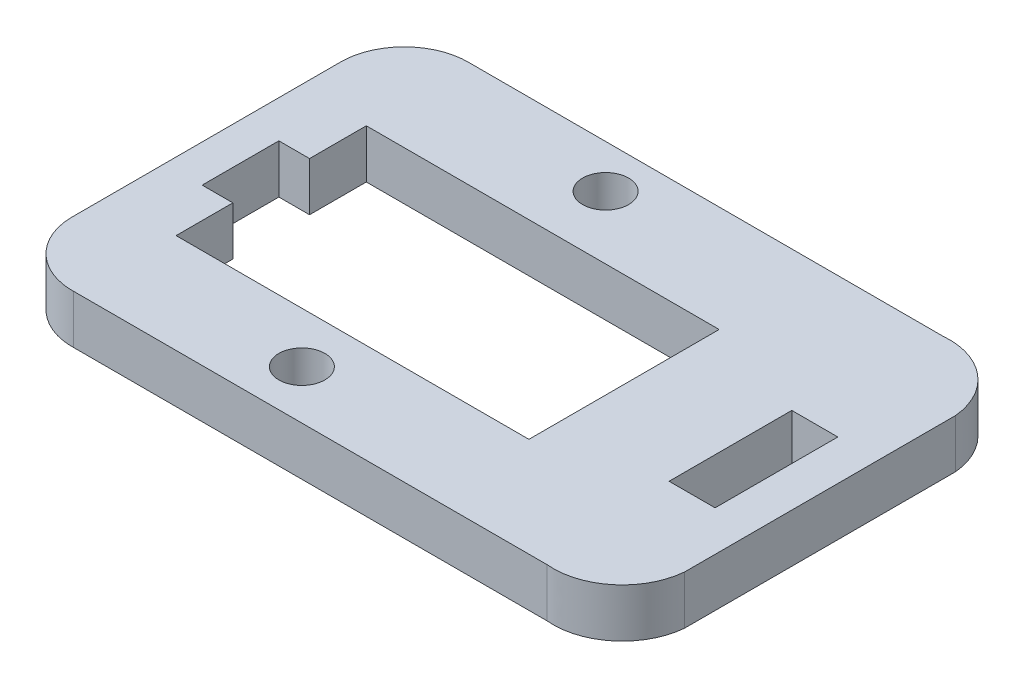
ISO-10303-21;
HEADER;
FILE_DESCRIPTION(('STEP AP214'),'2;1');
FILE_NAME('part.step','',(''),(''),'','','');
FILE_SCHEMA(('AUTOMOTIVE_DESIGN { 1 0 10303 214 1 1 1 1 }'));
ENDSEC;
DATA;
#1=APPLICATION_CONTEXT('core data for automotive mechanical design processes');
#2=APPLICATION_PROTOCOL_DEFINITION('international standard','automotive_design',2000,#1);
#3=PRODUCT_CONTEXT('',#1,'mechanical');
#4=PRODUCT('Part','Part','',(#3));
#5=PRODUCT_RELATED_PRODUCT_CATEGORY('part','',(#4));
#6=PRODUCT_DEFINITION_FORMATION('','',#4);
#7=PRODUCT_DEFINITION_CONTEXT('part definition',#1,'design');
#8=PRODUCT_DEFINITION('design','',#6,#7);
#9=PRODUCT_DEFINITION_SHAPE('','',#8);
#10=(LENGTH_UNIT() NAMED_UNIT(*) SI_UNIT(.MILLI.,.METRE.));
#11=(NAMED_UNIT(*) PLANE_ANGLE_UNIT() SI_UNIT($,.RADIAN.));
#12=(NAMED_UNIT(*) SI_UNIT($,.STERADIAN.) SOLID_ANGLE_UNIT());
#13=UNCERTAINTY_MEASURE_WITH_UNIT(LENGTH_MEASURE(1.E-05),#10,'distance_accuracy_value','');
#14=(GEOMETRIC_REPRESENTATION_CONTEXT(3) GLOBAL_UNCERTAINTY_ASSIGNED_CONTEXT((#13)) GLOBAL_UNIT_ASSIGNED_CONTEXT((#10,
#11,#12)) REPRESENTATION_CONTEXT('',''));
#15=CARTESIAN_POINT('',(0.,0.,0.));
#16=DIRECTION('',(0.,0.,1.));
#17=DIRECTION('',(1.,0.,0.));
#18=AXIS2_PLACEMENT_3D('',#15,#16,#17);
#19=CARTESIAN_POINT('',(18.3951645790076,3.175,-11.8734876889749));
#20=DIRECTION('',(0.,1.,0.));
#21=DIRECTION('',(0.,0.,1.));
#22=AXIS2_PLACEMENT_3D('',#19,#20,#21);
#23=PLANE('',#22);
#24=CARTESIAN_POINT('',(-4.06191002033368,3.175,-10.0835999914994));
#25=DIRECTION('',(0.,1.,0.));
#26=DIRECTION('',(0.,0.,1.));
#27=AXIS2_PLACEMENT_3D('',#24,#25,#26);
#28=CIRCLE('',#27,1.49995000333347);
#29=CARTESIAN_POINT('',(-4.06191002033368,3.175,-8.58364998816594));
#30=VERTEX_POINT('',#29);
#31=EDGE_CURVE('E202',#30,#30,#28,.T.);
#32=ORIENTED_EDGE('',*,*,#31,.F.);
#33=EDGE_LOOP('',(#32));
#34=FACE_BOUND('',#33,.T.);
#35=DIRECTION('',(-1.,0.,0.));
#36=VECTOR('',#35,1.);
#37=CARTESIAN_POINT('',(-17.5613,3.175,-2.28364999999999));
#38=LINE('',#37,#36);
#39=CARTESIAN_POINT('',(-15.5612,3.175,-2.28364999999999));
#40=VERTEX_POINT('',#39);
#41=CARTESIAN_POINT('',(-17.5613,3.175,-2.28364999999999));
#42=VERTEX_POINT('',#41);
#43=EDGE_CURVE('E214',#40,#42,#38,.T.);
#44=ORIENTED_EDGE('',*,*,#43,.F.);
#45=DIRECTION('',(0.,0.,1.));
#46=VECTOR('',#45,1.);
#47=CARTESIAN_POINT('',(-15.5612,3.175,-2.28364999999999));
#48=LINE('',#47,#46);
#49=CARTESIAN_POINT('',(-15.5612,3.175,-5.98375));
#50=VERTEX_POINT('',#49);
#51=EDGE_CURVE('E212',#50,#40,#48,.T.);
#52=ORIENTED_EDGE('',*,*,#51,.F.);
#53=DIRECTION('',(-1.,0.,0.));
#54=VECTOR('',#53,1.);
#55=CARTESIAN_POINT('',(-15.5612,3.175,-5.98375));
#56=LINE('',#55,#54);
#57=CARTESIAN_POINT('',(7.43880000000001,3.175,-5.98375));
#58=VERTEX_POINT('',#57);
#59=EDGE_CURVE('E228',#58,#50,#56,.T.);
#60=ORIENTED_EDGE('',*,*,#59,.F.);
#61=DIRECTION('',(0.,0.,-1.));
#62=VECTOR('',#61,1.);
#63=CARTESIAN_POINT('',(7.43880000000001,3.175,-5.98375));
#64=LINE('',#63,#62);
#65=CARTESIAN_POINT('',(7.43880000000001,3.175,6.41625));
#66=VERTEX_POINT('',#65);
#67=EDGE_CURVE('E225',#66,#58,#64,.T.);
#68=ORIENTED_EDGE('',*,*,#67,.F.);
#69=DIRECTION('',(1.,0.,0.));
#70=VECTOR('',#69,1.);
#71=CARTESIAN_POINT('',(7.43880000000001,3.175,6.41625));
#72=LINE('',#71,#70);
#73=CARTESIAN_POINT('',(-15.5612,3.175,6.41625));
#74=VERTEX_POINT('',#73);
#75=EDGE_CURVE('E223',#74,#66,#72,.T.);
#76=ORIENTED_EDGE('',*,*,#75,.F.);
#77=DIRECTION('',(0.,0.,1.));
#78=VECTOR('',#77,1.);
#79=CARTESIAN_POINT('',(-15.5612,3.175,6.41625));
#80=LINE('',#79,#78);
#81=CARTESIAN_POINT('',(-15.5612,3.175,2.71634999999999));
#82=VERTEX_POINT('',#81);
#83=EDGE_CURVE('E221',#82,#74,#80,.T.);
#84=ORIENTED_EDGE('',*,*,#83,.F.);
#85=DIRECTION('',(1.,0.,0.));
#86=VECTOR('',#85,1.);
#87=CARTESIAN_POINT('',(-15.5612,3.175,2.71634999999999));
#88=LINE('',#87,#86);
#89=CARTESIAN_POINT('',(-17.5613,3.175,2.71634999999999));
#90=VERTEX_POINT('',#89);
#91=EDGE_CURVE('E219',#90,#82,#88,.T.);
#92=ORIENTED_EDGE('',*,*,#91,.F.);
#93=DIRECTION('',(0.,0.,1.));
#94=VECTOR('',#93,1.);
#95=CARTESIAN_POINT('',(-17.5613,3.175,2.71634999999999));
#96=LINE('',#95,#94);
#97=EDGE_CURVE('E217',#42,#90,#96,.T.);
#98=ORIENTED_EDGE('',*,*,#97,.F.);
#99=EDGE_LOOP('',(#44,#52,#60,#68,#76,#84,#92,#98));
#100=FACE_BOUND('',#99,.T.);
#101=CARTESIAN_POINT('',(20.,3.175,-8.83175000000001));
#102=CARTESIAN_POINT('',(19.7745025200436,3.175,-11.2943530239767));
#103=CARTESIAN_POINT('',(17.5751030239767,3.175,-13.1246474799564));
#104=CARTESIAN_POINT('',(15.1125,3.175,-12.89915));
#105=B_SPLINE_CURVE_WITH_KNOTS('',3,(#101,#102,#103,#104),.UNSPECIFIED.,.F.,.F.,(4,4),
(0.111111111111111,0.222222222222222),.UNSPECIFIED.);
#106=CARTESIAN_POINT('',(20.,3.175,-8.83175000000001));
#107=VERTEX_POINT('',#106);
#108=CARTESIAN_POINT('',(15.1125,3.175,-12.89915));
#109=VERTEX_POINT('',#108);
#110=EDGE_CURVE('E270',#107,#109,#105,.T.);
#111=ORIENTED_EDGE('',*,*,#110,.T.);
#112=DIRECTION('',(-1.,0.,0.));
#113=VECTOR('',#112,1.);
#114=CARTESIAN_POINT('',(-15.7526,3.175,-12.89915));
#115=LINE('',#114,#113);
#116=CARTESIAN_POINT('',(-15.7526,3.175,-12.89915));
#117=VERTEX_POINT('',#116);
#118=EDGE_CURVE('E276',#109,#117,#115,.T.);
#119=ORIENTED_EDGE('',*,*,#118,.T.);
#120=CARTESIAN_POINT('',(-15.7526,3.175,-12.89915));
#121=CARTESIAN_POINT('',(-18.0392006638147,3.175,-12.9486506638147));
#122=CARTESIAN_POINT('',(-19.9504993361853,3.175,-11.1183506638147));
#123=CARTESIAN_POINT('',(-20.,3.175,-8.83175000000001));
#124=B_SPLINE_CURVE_WITH_KNOTS('',3,(#120,#121,#122,#123),.UNSPECIFIED.,.F.,.F.,(4,4),
(0.777777777777778,1.),.UNSPECIFIED.);
#125=CARTESIAN_POINT('',(-20.,3.175,-8.83175000000001));
#126=VERTEX_POINT('',#125);
#127=EDGE_CURVE('E282',#117,#126,#124,.T.);
#128=ORIENTED_EDGE('',*,*,#127,.T.);
#129=DIRECTION('',(0.,0.,1.));
#130=VECTOR('',#129,1.);
#131=CARTESIAN_POINT('',(-20.,3.175,8.83175));
#132=LINE('',#131,#130);
#133=CARTESIAN_POINT('',(-20.,3.175,8.83175));
#134=VERTEX_POINT('',#133);
#135=EDGE_CURVE('E287',#126,#134,#132,.T.);
#136=ORIENTED_EDGE('',*,*,#135,.T.);
#137=CARTESIAN_POINT('',(-20.,3.175,8.83175));
#138=CARTESIAN_POINT('',(-19.9504993361853,3.175,11.1183506638147));
#139=CARTESIAN_POINT('',(-18.0392006638147,3.175,12.9486506638147));
#140=CARTESIAN_POINT('',(-15.7526,3.175,12.89915));
#141=B_SPLINE_CURVE_WITH_KNOTS('',3,(#137,#138,#139,#140),.UNSPECIFIED.,.F.,.F.,(4,4),
(0.555555555555556,0.666666666666667),.UNSPECIFIED.);
#142=CARTESIAN_POINT('',(-15.7526,3.175,12.89915));
#143=VERTEX_POINT('',#142);
#144=EDGE_CURVE('E413',#134,#143,#141,.T.);
#145=ORIENTED_EDGE('',*,*,#144,.T.);
#146=DIRECTION('',(1.,0.,0.));
#147=VECTOR('',#146,1.);
#148=CARTESIAN_POINT('',(15.1125,3.175,12.89915));
#149=LINE('',#148,#147);
#150=CARTESIAN_POINT('',(15.1125,3.175,12.89915));
#151=VERTEX_POINT('',#150);
#152=EDGE_CURVE('E338',#143,#151,#149,.T.);
#153=ORIENTED_EDGE('',*,*,#152,.T.);
#154=CARTESIAN_POINT('',(15.1125,3.175,12.89915));
#155=CARTESIAN_POINT('',(17.5751030239767,3.175,13.1246474799564));
#156=CARTESIAN_POINT('',(19.7745025200436,3.175,11.2943530239767));
#157=CARTESIAN_POINT('',(20.,3.175,8.83175000000001));
#158=B_SPLINE_CURVE_WITH_KNOTS('',3,(#154,#155,#156,#157),.UNSPECIFIED.,.F.,.F.,(4,4),
(0.333333333333333,0.444444444444444),.UNSPECIFIED.);
#159=CARTESIAN_POINT('',(20.,3.175,8.83175000000001));
#160=VERTEX_POINT('',#159);
#161=EDGE_CURVE('E331',#151,#160,#158,.T.);
#162=ORIENTED_EDGE('',*,*,#161,.T.);
#163=DIRECTION('',(0.,0.,-1.));
#164=VECTOR('',#163,1.);
#165=CARTESIAN_POINT('',(20.,3.175,-8.83175000000001));
#166=LINE('',#165,#164);
#167=EDGE_CURVE('E337',#160,#107,#166,.T.);
#168=ORIENTED_EDGE('',*,*,#167,.T.);
#169=EDGE_LOOP('',(#111,#119,#128,#136,#145,#153,#162,#168));
#170=FACE_BOUND('',#169,.T.);
#171=DIRECTION('',(1.,0.,0.));
#172=VECTOR('',#171,1.);
#173=CARTESIAN_POINT('',(17.3744,3.175,4.21635000000001));
#174=LINE('',#173,#172);
#175=CARTESIAN_POINT('',(14.3743,3.175,4.21635000000001));
#176=VERTEX_POINT('',#175);
#177=CARTESIAN_POINT('',(17.3744,3.175,4.21635000000001));
#178=VERTEX_POINT('',#177);
#179=EDGE_CURVE('E181',#176,#178,#174,.T.);
#180=ORIENTED_EDGE('',*,*,#179,.F.);
#181=DIRECTION('',(0.,0.,1.));
#182=VECTOR('',#181,1.);
#183=CARTESIAN_POINT('',(14.3743,3.175,4.21635000000001));
#184=LINE('',#183,#182);
#185=CARTESIAN_POINT('',(14.3743,3.175,-3.78365));
#186=VERTEX_POINT('',#185);
#187=EDGE_CURVE('E173',#186,#176,#184,.T.);
#188=ORIENTED_EDGE('',*,*,#187,.F.);
#189=DIRECTION('',(-1.,0.,0.));
#190=VECTOR('',#189,1.);
#191=CARTESIAN_POINT('',(14.3743,3.175,-3.78365));
#192=LINE('',#191,#190);
#193=CARTESIAN_POINT('',(17.3744,3.175,-3.78365));
#194=VERTEX_POINT('',#193);
#195=EDGE_CURVE('E196',#194,#186,#192,.T.);
#196=ORIENTED_EDGE('',*,*,#195,.F.);
#197=DIRECTION('',(0.,0.,-1.));
#198=VECTOR('',#197,1.);
#199=CARTESIAN_POINT('',(17.3744,3.175,-3.78365));
#200=LINE('',#199,#198);
#201=EDGE_CURVE('E194',#178,#194,#200,.T.);
#202=ORIENTED_EDGE('',*,*,#201,.F.);
#203=EDGE_LOOP('',(#180,#188,#196,#202));
#204=FACE_BOUND('',#203,.T.);
#205=CARTESIAN_POINT('',(-4.06191002033367,3.175,9.71634999999999));
#206=DIRECTION('',(0.,1.,0.));
#207=DIRECTION('',(0.,0.,1.));
#208=AXIS2_PLACEMENT_3D('',#205,#206,#207);
#209=CIRCLE('',#208,1.49995000976641);
#210=CARTESIAN_POINT('',(-4.06191002033367,3.175,11.2163000097664));
#211=VERTEX_POINT('',#210);
#212=EDGE_CURVE('E617',#211,#211,#209,.T.);
#213=ORIENTED_EDGE('',*,*,#212,.F.);
#214=EDGE_LOOP('',(#213));
#215=FACE_BOUND('',#214,.T.);
#216=ADVANCED_FACE('F35',(#34,#100,#170,#204,#215),#23,.T.);
#217=CARTESIAN_POINT('',(18.3951645790076,0.,-11.8734876889749));
#218=DIRECTION('',(0.,1.,0.));
#219=DIRECTION('',(0.,0.,1.));
#220=AXIS2_PLACEMENT_3D('',#217,#218,#219);
#221=PLANE('',#220);
#222=CARTESIAN_POINT('',(-4.06191002033368,0.,-10.0835999914994));
#223=DIRECTION('',(0.,1.,0.));
#224=DIRECTION('',(0.,0.,1.));
#225=AXIS2_PLACEMENT_3D('',#222,#223,#224);
#226=CIRCLE('',#225,1.49995000333347);
#227=CARTESIAN_POINT('',(-4.06191002033368,0.,-8.58364998816594));
#228=VERTEX_POINT('',#227);
#229=EDGE_CURVE('E623',#228,#228,#226,.T.);
#230=ORIENTED_EDGE('',*,*,#229,.T.);
#231=EDGE_LOOP('',(#230));
#232=FACE_BOUND('',#231,.T.);
#233=DIRECTION('',(0.,0.,1.));
#234=VECTOR('',#233,1.);
#235=CARTESIAN_POINT('',(-15.5612,0.,-2.28364999999999));
#236=LINE('',#235,#234);
#237=CARTESIAN_POINT('',(-15.5612,0.,-5.98375));
#238=VERTEX_POINT('',#237);
#239=CARTESIAN_POINT('',(-15.5612,0.,-2.28364999999999));
#240=VERTEX_POINT('',#239);
#241=EDGE_CURVE('E189',#238,#240,#236,.T.);
#242=ORIENTED_EDGE('',*,*,#241,.T.);
#243=DIRECTION('',(-1.,0.,0.));
#244=VECTOR('',#243,1.);
#245=CARTESIAN_POINT('',(-17.5613,0.,-2.28364999999999));
#246=LINE('',#245,#244);
#247=CARTESIAN_POINT('',(-17.5613,0.,-2.28364999999999));
#248=VERTEX_POINT('',#247);
#249=EDGE_CURVE('E233',#240,#248,#246,.T.);
#250=ORIENTED_EDGE('',*,*,#249,.T.);
#251=DIRECTION('',(0.,0.,1.));
#252=VECTOR('',#251,1.);
#253=CARTESIAN_POINT('',(-17.5613,0.,2.71634999999999));
#254=LINE('',#253,#252);
#255=CARTESIAN_POINT('',(-17.5613,0.,2.71634999999999));
#256=VERTEX_POINT('',#255);
#257=EDGE_CURVE('E236',#248,#256,#254,.T.);
#258=ORIENTED_EDGE('',*,*,#257,.T.);
#259=DIRECTION('',(1.,0.,0.));
#260=VECTOR('',#259,1.);
#261=CARTESIAN_POINT('',(-15.5612,0.,2.71634999999999));
#262=LINE('',#261,#260);
#263=CARTESIAN_POINT('',(-15.5612,0.,2.71634999999999));
#264=VERTEX_POINT('',#263);
#265=EDGE_CURVE('E239',#256,#264,#262,.T.);
#266=ORIENTED_EDGE('',*,*,#265,.T.);
#267=DIRECTION('',(0.,0.,1.));
#268=VECTOR('',#267,1.);
#269=CARTESIAN_POINT('',(-15.5612,0.,6.41625));
#270=LINE('',#269,#268);
#271=CARTESIAN_POINT('',(-15.5612,0.,6.41625));
#272=VERTEX_POINT('',#271);
#273=EDGE_CURVE('E242',#264,#272,#270,.T.);
#274=ORIENTED_EDGE('',*,*,#273,.T.);
#275=DIRECTION('',(1.,0.,0.));
#276=VECTOR('',#275,1.);
#277=CARTESIAN_POINT('',(7.43880000000001,0.,6.41625));
#278=LINE('',#277,#276);
#279=CARTESIAN_POINT('',(7.43880000000001,0.,6.41625));
#280=VERTEX_POINT('',#279);
#281=EDGE_CURVE('E245',#272,#280,#278,.T.);
#282=ORIENTED_EDGE('',*,*,#281,.T.);
#283=DIRECTION('',(0.,0.,-1.));
#284=VECTOR('',#283,1.);
#285=CARTESIAN_POINT('',(7.43880000000001,0.,-5.98375));
#286=LINE('',#285,#284);
#287=CARTESIAN_POINT('',(7.43880000000001,0.,-5.98375));
#288=VERTEX_POINT('',#287);
#289=EDGE_CURVE('E248',#280,#288,#286,.T.);
#290=ORIENTED_EDGE('',*,*,#289,.T.);
#291=DIRECTION('',(-1.,0.,0.));
#292=VECTOR('',#291,1.);
#293=CARTESIAN_POINT('',(-15.5612,0.,-5.98375));
#294=LINE('',#293,#292);
#295=EDGE_CURVE('E215',#288,#238,#294,.T.);
#296=ORIENTED_EDGE('',*,*,#295,.T.);
#297=EDGE_LOOP('',(#242,#250,#258,#266,#274,#282,#290,#296));
#298=FACE_BOUND('',#297,.T.);
#299=CARTESIAN_POINT('',(20.,0.,-8.83175000000001));
#300=CARTESIAN_POINT('',(19.7745025200436,0.,-11.2943530239767));
#301=CARTESIAN_POINT('',(17.5751030239767,0.,-13.1246474799564));
#302=CARTESIAN_POINT('',(15.1125,0.,-12.89915));
#303=B_SPLINE_CURVE_WITH_KNOTS('',3,(#299,#300,#301,#302),.UNSPECIFIED.,.F.,.F.,(4,4),
(0.111111111111111,0.222222222222222),.UNSPECIFIED.);
#304=CARTESIAN_POINT('',(20.,0.,-8.83175000000001));
#305=VERTEX_POINT('',#304);
#306=CARTESIAN_POINT('',(15.1125,0.,-12.89915));
#307=VERTEX_POINT('',#306);
#308=EDGE_CURVE('E269',#305,#307,#303,.T.);
#309=ORIENTED_EDGE('',*,*,#308,.F.);
#310=DIRECTION('',(0.,0.,-1.));
#311=VECTOR('',#310,1.);
#312=CARTESIAN_POINT('',(20.,0.,-8.83175000000001));
#313=LINE('',#312,#311);
#314=CARTESIAN_POINT('',(20.,0.,8.83175000000001));
#315=VERTEX_POINT('',#314);
#316=EDGE_CURVE('E277',#315,#305,#313,.T.);
#317=ORIENTED_EDGE('',*,*,#316,.F.);
#318=CARTESIAN_POINT('',(15.1125,0.,12.89915));
#319=CARTESIAN_POINT('',(17.5751030239767,0.,13.1246474799564));
#320=CARTESIAN_POINT('',(19.7745025200436,0.,11.2943530239767));
#321=CARTESIAN_POINT('',(20.,0.,8.83175000000001));
#322=B_SPLINE_CURVE_WITH_KNOTS('',3,(#318,#319,#320,#321),.UNSPECIFIED.,.F.,.F.,(4,4),
(0.333333333333333,0.444444444444444),.UNSPECIFIED.);
#323=CARTESIAN_POINT('',(15.1125,0.,12.89915));
#324=VERTEX_POINT('',#323);
#325=EDGE_CURVE('E371',#324,#315,#322,.T.);
#326=ORIENTED_EDGE('',*,*,#325,.F.);
#327=DIRECTION('',(1.,0.,0.));
#328=VECTOR('',#327,1.);
#329=CARTESIAN_POINT('',(15.1125,0.,12.89915));
#330=LINE('',#329,#328);
#331=CARTESIAN_POINT('',(-15.7526,0.,12.89915));
#332=VERTEX_POINT('',#331);
#333=EDGE_CURVE('E366',#332,#324,#330,.T.);
#334=ORIENTED_EDGE('',*,*,#333,.F.);
#335=CARTESIAN_POINT('',(-20.,0.,8.83175));
#336=CARTESIAN_POINT('',(-19.9504993361853,0.,11.1183506638147));
#337=CARTESIAN_POINT('',(-18.0392006638147,0.,12.9486506638147));
#338=CARTESIAN_POINT('',(-15.7526,0.,12.89915));
#339=B_SPLINE_CURVE_WITH_KNOTS('',3,(#335,#336,#337,#338),.UNSPECIFIED.,.F.,.F.,(4,4),
(0.555555555555556,0.666666666666667),.UNSPECIFIED.);
#340=CARTESIAN_POINT('',(-20.,0.,8.83175));
#341=VERTEX_POINT('',#340);
#342=EDGE_CURVE('E362',#341,#332,#339,.T.);
#343=ORIENTED_EDGE('',*,*,#342,.F.);
#344=DIRECTION('',(0.,0.,1.));
#345=VECTOR('',#344,1.);
#346=CARTESIAN_POINT('',(-20.,0.,8.83175));
#347=LINE('',#346,#345);
#348=CARTESIAN_POINT('',(-20.,0.,-8.83175000000001));
#349=VERTEX_POINT('',#348);
#350=EDGE_CURVE('E357',#349,#341,#347,.T.);
#351=ORIENTED_EDGE('',*,*,#350,.F.);
#352=CARTESIAN_POINT('',(-15.7526,0.,-12.89915));
#353=CARTESIAN_POINT('',(-18.0392006638147,0.,-12.9486506638147));
#354=CARTESIAN_POINT('',(-19.9504993361853,0.,-11.1183506638147));
#355=CARTESIAN_POINT('',(-20.,0.,-8.83175000000001));
#356=B_SPLINE_CURVE_WITH_KNOTS('',3,(#352,#353,#354,#355),.UNSPECIFIED.,.F.,.F.,(4,4),
(0.777777777777778,1.),.UNSPECIFIED.);
#357=CARTESIAN_POINT('',(-15.7526,0.,-12.89915));
#358=VERTEX_POINT('',#357);
#359=EDGE_CURVE('E353',#358,#349,#356,.T.);
#360=ORIENTED_EDGE('',*,*,#359,.F.);
#361=DIRECTION('',(-1.,0.,0.));
#362=VECTOR('',#361,1.);
#363=CARTESIAN_POINT('',(-15.7526,0.,-12.89915));
#364=LINE('',#363,#362);
#365=EDGE_CURVE('E348',#307,#358,#364,.T.);
#366=ORIENTED_EDGE('',*,*,#365,.F.);
#367=EDGE_LOOP('',(#309,#317,#326,#334,#343,#351,#360,#366));
#368=FACE_BOUND('',#367,.T.);
#369=DIRECTION('',(0.,0.,1.));
#370=VECTOR('',#369,1.);
#371=CARTESIAN_POINT('',(14.3743,0.,4.21635000000001));
#372=LINE('',#371,#370);
#373=CARTESIAN_POINT('',(14.3743,0.,-3.78365));
#374=VERTEX_POINT('',#373);
#375=CARTESIAN_POINT('',(14.3743,0.,4.21635000000001));
#376=VERTEX_POINT('',#375);
#377=EDGE_CURVE('E59',#374,#376,#372,.T.);
#378=ORIENTED_EDGE('',*,*,#377,.T.);
#379=DIRECTION('',(1.,0.,0.));
#380=VECTOR('',#379,1.);
#381=CARTESIAN_POINT('',(17.3744,0.,4.21635000000001));
#382=LINE('',#381,#380);
#383=CARTESIAN_POINT('',(17.3744,0.,4.21635000000001));
#384=VERTEX_POINT('',#383);
#385=EDGE_CURVE('E188',#376,#384,#382,.T.);
#386=ORIENTED_EDGE('',*,*,#385,.T.);
#387=DIRECTION('',(0.,0.,-1.));
#388=VECTOR('',#387,1.);
#389=CARTESIAN_POINT('',(17.3744,0.,-3.78365));
#390=LINE('',#389,#388);
#391=CARTESIAN_POINT('',(17.3744,0.,-3.78365));
#392=VERTEX_POINT('',#391);
#393=EDGE_CURVE('E204',#384,#392,#390,.T.);
#394=ORIENTED_EDGE('',*,*,#393,.T.);
#395=DIRECTION('',(-1.,0.,0.));
#396=VECTOR('',#395,1.);
#397=CARTESIAN_POINT('',(14.3743,0.,-3.78365));
#398=LINE('',#397,#396);
#399=EDGE_CURVE('E182',#392,#374,#398,.T.);
#400=ORIENTED_EDGE('',*,*,#399,.T.);
#401=EDGE_LOOP('',(#378,#386,#394,#400));
#402=FACE_BOUND('',#401,.T.);
#403=CARTESIAN_POINT('',(-4.06191002033367,0.,9.71634999999999));
#404=DIRECTION('',(0.,1.,0.));
#405=DIRECTION('',(0.,0.,1.));
#406=AXIS2_PLACEMENT_3D('',#403,#404,#405);
#407=CIRCLE('',#406,1.49995000976641);
#408=CARTESIAN_POINT('',(-4.06191002033367,0.,11.2163000097664));
#409=VERTEX_POINT('',#408);
#410=EDGE_CURVE('E620',#409,#409,#407,.T.);
#411=ORIENTED_EDGE('',*,*,#410,.T.);
#412=EDGE_LOOP('',(#411));
#413=FACE_BOUND('',#412,.T.);
#414=ADVANCED_FACE('F305',(#232,#298,#368,#402,#413),#221,.F.);
#415=DIRECTION('',(0.,-1.,0.));
#416=VECTOR('',#415,1.);
#417=SURFACE_OF_LINEAR_EXTRUSION('',#105,#416);
#418=ORIENTED_EDGE('',*,*,#308,.T.);
#419=DIRECTION('',(0.,-1.,0.));
#420=VECTOR('',#419,1.);
#421=CARTESIAN_POINT('',(15.1125,3.175,-12.89915));
#422=LINE('',#421,#420);
#423=EDGE_CURVE('E11',#109,#307,#422,.T.);
#424=ORIENTED_EDGE('',*,*,#423,.F.);
#425=ORIENTED_EDGE('',*,*,#110,.F.);
#426=DIRECTION('',(0.,-1.,0.));
#427=VECTOR('',#426,1.);
#428=CARTESIAN_POINT('',(20.,3.175,-8.83175000000001));
#429=LINE('',#428,#427);
#430=EDGE_CURVE('E343',#107,#305,#429,.T.);
#431=ORIENTED_EDGE('',*,*,#430,.T.);
#432=EDGE_LOOP('',(#418,#424,#425,#431));
#433=FACE_BOUND('',#432,.T.);
#434=ADVANCED_FACE('F37',(#433),#417,.F.);
#435=CARTESIAN_POINT('',(-15.7526,3.175,-12.89915));
#436=DIRECTION('',(0.,0.,1.));
#437=DIRECTION('',(1.,0.,0.));
#438=AXIS2_PLACEMENT_3D('',#435,#436,#437);
#439=PLANE('',#438);
#440=ORIENTED_EDGE('',*,*,#365,.T.);
#441=DIRECTION('',(0.,-1.,0.));
#442=VECTOR('',#441,1.);
#443=CARTESIAN_POINT('',(-15.7526,3.175,-12.89915));
#444=LINE('',#443,#442);
#445=EDGE_CURVE('E44',#117,#358,#444,.T.);
#446=ORIENTED_EDGE('',*,*,#445,.F.);
#447=ORIENTED_EDGE('',*,*,#118,.F.);
#448=ORIENTED_EDGE('',*,*,#423,.T.);
#449=EDGE_LOOP('',(#440,#446,#447,#448));
#450=FACE_BOUND('',#449,.T.);
#451=ADVANCED_FACE('F297',(#450),#439,.F.);
#452=DIRECTION('',(0.,-1.,0.));
#453=VECTOR('',#452,1.);
#454=SURFACE_OF_LINEAR_EXTRUSION('',#124,#453);
#455=ORIENTED_EDGE('',*,*,#359,.T.);
#456=DIRECTION('',(0.,-1.,0.));
#457=VECTOR('',#456,1.);
#458=CARTESIAN_POINT('',(-20.,3.175,-8.83175000000001));
#459=LINE('',#458,#457);
#460=EDGE_CURVE('E393',#126,#349,#459,.T.);
#461=ORIENTED_EDGE('',*,*,#460,.F.);
#462=ORIENTED_EDGE('',*,*,#127,.F.);
#463=ORIENTED_EDGE('',*,*,#445,.T.);
#464=EDGE_LOOP('',(#455,#461,#462,#463));
#465=FACE_BOUND('',#464,.T.);
#466=ADVANCED_FACE('F293',(#465),#454,.F.);
#467=CARTESIAN_POINT('',(-20.,3.175,8.83175));
#468=DIRECTION('',(1.,0.,0.));
#469=DIRECTION('',(0.,0.,-1.));
#470=AXIS2_PLACEMENT_3D('',#467,#468,#469);
#471=PLANE('',#470);
#472=ORIENTED_EDGE('',*,*,#350,.T.);
#473=DIRECTION('',(0.,-1.,0.));
#474=VECTOR('',#473,1.);
#475=CARTESIAN_POINT('',(-20.,3.175,8.83175));
#476=LINE('',#475,#474);
#477=EDGE_CURVE('E390',#134,#341,#476,.T.);
#478=ORIENTED_EDGE('',*,*,#477,.F.);
#479=ORIENTED_EDGE('',*,*,#135,.F.);
#480=ORIENTED_EDGE('',*,*,#460,.T.);
#481=EDGE_LOOP('',(#472,#478,#479,#480));
#482=FACE_BOUND('',#481,.T.);
#483=ADVANCED_FACE('F296',(#482),#471,.F.);
#484=DIRECTION('',(0.,-1.,0.));
#485=VECTOR('',#484,1.);
#486=SURFACE_OF_LINEAR_EXTRUSION('',#141,#485);
#487=ORIENTED_EDGE('',*,*,#342,.T.);
#488=DIRECTION('',(0.,-1.,0.));
#489=VECTOR('',#488,1.);
#490=CARTESIAN_POINT('',(-15.7526,3.175,12.89915));
#491=LINE('',#490,#489);
#492=EDGE_CURVE('E387',#143,#332,#491,.T.);
#493=ORIENTED_EDGE('',*,*,#492,.F.);
#494=ORIENTED_EDGE('',*,*,#144,.F.);
#495=ORIENTED_EDGE('',*,*,#477,.T.);
#496=EDGE_LOOP('',(#487,#493,#494,#495));
#497=FACE_BOUND('',#496,.T.);
#498=ADVANCED_FACE('F411',(#497),#486,.F.);
#499=CARTESIAN_POINT('',(15.1125,3.175,12.89915));
#500=DIRECTION('',(0.,0.,-1.));
#501=DIRECTION('',(-1.,0.,0.));
#502=AXIS2_PLACEMENT_3D('',#499,#500,#501);
#503=PLANE('',#502);
#504=ORIENTED_EDGE('',*,*,#333,.T.);
#505=DIRECTION('',(0.,-1.,0.));
#506=VECTOR('',#505,1.);
#507=CARTESIAN_POINT('',(15.1125,3.175,12.89915));
#508=LINE('',#507,#506);
#509=EDGE_CURVE('E384',#151,#324,#508,.T.);
#510=ORIENTED_EDGE('',*,*,#509,.F.);
#511=ORIENTED_EDGE('',*,*,#152,.F.);
#512=ORIENTED_EDGE('',*,*,#492,.T.);
#513=EDGE_LOOP('',(#504,#510,#511,#512));
#514=FACE_BOUND('',#513,.T.);
#515=ADVANCED_FACE('F329',(#514),#503,.F.);
#516=DIRECTION('',(0.,-1.,0.));
#517=VECTOR('',#516,1.);
#518=SURFACE_OF_LINEAR_EXTRUSION('',#158,#517);
#519=ORIENTED_EDGE('',*,*,#325,.T.);
#520=DIRECTION('',(0.,-1.,0.));
#521=VECTOR('',#520,1.);
#522=CARTESIAN_POINT('',(20.,3.175,8.83175000000001));
#523=LINE('',#522,#521);
#524=EDGE_CURVE('E381',#160,#315,#523,.T.);
#525=ORIENTED_EDGE('',*,*,#524,.F.);
#526=ORIENTED_EDGE('',*,*,#161,.F.);
#527=ORIENTED_EDGE('',*,*,#509,.T.);
#528=EDGE_LOOP('',(#519,#525,#526,#527));
#529=FACE_BOUND('',#528,.T.);
#530=ADVANCED_FACE('F324',(#529),#518,.F.);
#531=CARTESIAN_POINT('',(20.,3.175,-8.83175000000001));
#532=DIRECTION('',(-1.,0.,0.));
#533=DIRECTION('',(0.,0.,1.));
#534=AXIS2_PLACEMENT_3D('',#531,#532,#533);
#535=PLANE('',#534);
#536=ORIENTED_EDGE('',*,*,#316,.T.);
#537=ORIENTED_EDGE('',*,*,#430,.F.);
#538=ORIENTED_EDGE('',*,*,#167,.F.);
#539=ORIENTED_EDGE('',*,*,#524,.T.);
#540=EDGE_LOOP('',(#536,#537,#538,#539));
#541=FACE_BOUND('',#540,.T.);
#542=ADVANCED_FACE('F321',(#541),#535,.F.);
#543=CARTESIAN_POINT('',(-15.5612,3.175,-2.28364999999999));
#544=DIRECTION('',(1.,0.,0.));
#545=DIRECTION('',(0.,0.,-1.));
#546=AXIS2_PLACEMENT_3D('',#543,#544,#545);
#547=PLANE('',#546);
#548=ORIENTED_EDGE('',*,*,#241,.F.);
#549=DIRECTION('',(0.,-1.,0.));
#550=VECTOR('',#549,1.);
#551=CARTESIAN_POINT('',(-15.5612,3.175,-5.98375));
#552=LINE('',#551,#550);
#553=EDGE_CURVE('E230',#50,#238,#552,.T.);
#554=ORIENTED_EDGE('',*,*,#553,.F.);
#555=ORIENTED_EDGE('',*,*,#51,.T.);
#556=DIRECTION('',(0.,-1.,0.));
#557=VECTOR('',#556,1.);
#558=CARTESIAN_POINT('',(-15.5612,3.175,-2.28364999999999));
#559=LINE('',#558,#557);
#560=EDGE_CURVE('E267',#40,#240,#559,.T.);
#561=ORIENTED_EDGE('',*,*,#560,.T.);
#562=EDGE_LOOP('',(#548,#554,#555,#561));
#563=FACE_BOUND('',#562,.T.);
#564=ADVANCED_FACE('F318',(#563),#547,.T.);
#565=CARTESIAN_POINT('',(-17.5613,3.175,-2.28364999999999));
#566=DIRECTION('',(0.,0.,1.));
#567=DIRECTION('',(1.,0.,0.));
#568=AXIS2_PLACEMENT_3D('',#565,#566,#567);
#569=PLANE('',#568);
#570=ORIENTED_EDGE('',*,*,#249,.F.);
#571=ORIENTED_EDGE('',*,*,#560,.F.);
#572=ORIENTED_EDGE('',*,*,#43,.T.);
#573=DIRECTION('',(0.,-1.,0.));
#574=VECTOR('',#573,1.);
#575=CARTESIAN_POINT('',(-17.5613,3.175,-2.28364999999999));
#576=LINE('',#575,#574);
#577=EDGE_CURVE('E265',#42,#248,#576,.T.);
#578=ORIENTED_EDGE('',*,*,#577,.T.);
#579=EDGE_LOOP('',(#570,#571,#572,#578));
#580=FACE_BOUND('',#579,.T.);
#581=ADVANCED_FACE('F485',(#580),#569,.T.);
#582=CARTESIAN_POINT('',(-17.5613,3.175,2.71634999999999));
#583=DIRECTION('',(1.,0.,0.));
#584=DIRECTION('',(0.,0.,-1.));
#585=AXIS2_PLACEMENT_3D('',#582,#583,#584);
#586=PLANE('',#585);
#587=ORIENTED_EDGE('',*,*,#257,.F.);
#588=ORIENTED_EDGE('',*,*,#577,.F.);
#589=ORIENTED_EDGE('',*,*,#97,.T.);
#590=DIRECTION('',(0.,-1.,0.));
#591=VECTOR('',#590,1.);
#592=CARTESIAN_POINT('',(-17.5613,3.175,2.71634999999999));
#593=LINE('',#592,#591);
#594=EDGE_CURVE('E263',#90,#256,#593,.T.);
#595=ORIENTED_EDGE('',*,*,#594,.T.);
#596=EDGE_LOOP('',(#587,#588,#589,#595));
#597=FACE_BOUND('',#596,.T.);
#598=ADVANCED_FACE('F493',(#597),#586,.T.);
#599=CARTESIAN_POINT('',(-15.5612,3.175,2.71634999999999));
#600=DIRECTION('',(0.,0.,-1.));
#601=DIRECTION('',(-1.,0.,0.));
#602=AXIS2_PLACEMENT_3D('',#599,#600,#601);
#603=PLANE('',#602);
#604=ORIENTED_EDGE('',*,*,#265,.F.);
#605=ORIENTED_EDGE('',*,*,#594,.F.);
#606=ORIENTED_EDGE('',*,*,#91,.T.);
#607=DIRECTION('',(0.,-1.,0.));
#608=VECTOR('',#607,1.);
#609=CARTESIAN_POINT('',(-15.5612,3.175,2.71634999999999));
#610=LINE('',#609,#608);
#611=EDGE_CURVE('E261',#82,#264,#610,.T.);
#612=ORIENTED_EDGE('',*,*,#611,.T.);
#613=EDGE_LOOP('',(#604,#605,#606,#612));
#614=FACE_BOUND('',#613,.T.);
#615=ADVANCED_FACE('F501',(#614),#603,.T.);
#616=CARTESIAN_POINT('',(-15.5612,3.175,6.41625));
#617=DIRECTION('',(1.,0.,0.));
#618=DIRECTION('',(0.,0.,-1.));
#619=AXIS2_PLACEMENT_3D('',#616,#617,#618);
#620=PLANE('',#619);
#621=ORIENTED_EDGE('',*,*,#273,.F.);
#622=ORIENTED_EDGE('',*,*,#611,.F.);
#623=ORIENTED_EDGE('',*,*,#83,.T.);
#624=DIRECTION('',(0.,-1.,0.));
#625=VECTOR('',#624,1.);
#626=CARTESIAN_POINT('',(-15.5612,3.175,6.41625));
#627=LINE('',#626,#625);
#628=EDGE_CURVE('E259',#74,#272,#627,.T.);
#629=ORIENTED_EDGE('',*,*,#628,.T.);
#630=EDGE_LOOP('',(#621,#622,#623,#629));
#631=FACE_BOUND('',#630,.T.);
#632=ADVANCED_FACE('F510',(#631),#620,.T.);
#633=CARTESIAN_POINT('',(7.43880000000001,3.175,6.41625));
#634=DIRECTION('',(0.,0.,-1.));
#635=DIRECTION('',(-1.,0.,0.));
#636=AXIS2_PLACEMENT_3D('',#633,#634,#635);
#637=PLANE('',#636);
#638=ORIENTED_EDGE('',*,*,#281,.F.);
#639=ORIENTED_EDGE('',*,*,#628,.F.);
#640=ORIENTED_EDGE('',*,*,#75,.T.);
#641=DIRECTION('',(0.,-1.,0.));
#642=VECTOR('',#641,1.);
#643=CARTESIAN_POINT('',(7.43880000000001,3.175,6.41625));
#644=LINE('',#643,#642);
#645=EDGE_CURVE('E257',#66,#280,#644,.T.);
#646=ORIENTED_EDGE('',*,*,#645,.T.);
#647=EDGE_LOOP('',(#638,#639,#640,#646));
#648=FACE_BOUND('',#647,.T.);
#649=ADVANCED_FACE('F519',(#648),#637,.T.);
#650=CARTESIAN_POINT('',(7.43880000000001,3.175,-5.98375));
#651=DIRECTION('',(-1.,0.,0.));
#652=DIRECTION('',(0.,0.,1.));
#653=AXIS2_PLACEMENT_3D('',#650,#651,#652);
#654=PLANE('',#653);
#655=ORIENTED_EDGE('',*,*,#289,.F.);
#656=ORIENTED_EDGE('',*,*,#645,.F.);
#657=ORIENTED_EDGE('',*,*,#67,.T.);
#658=DIRECTION('',(0.,-1.,0.));
#659=VECTOR('',#658,1.);
#660=CARTESIAN_POINT('',(7.43880000000001,3.175,-5.98375));
#661=LINE('',#660,#659);
#662=EDGE_CURVE('E255',#58,#288,#661,.T.);
#663=ORIENTED_EDGE('',*,*,#662,.T.);
#664=EDGE_LOOP('',(#655,#656,#657,#663));
#665=FACE_BOUND('',#664,.T.);
#666=ADVANCED_FACE('F528',(#665),#654,.T.);
#667=CARTESIAN_POINT('',(-15.5612,3.175,-5.98375));
#668=DIRECTION('',(0.,0.,1.));
#669=DIRECTION('',(1.,0.,0.));
#670=AXIS2_PLACEMENT_3D('',#667,#668,#669);
#671=PLANE('',#670);
#672=ORIENTED_EDGE('',*,*,#295,.F.);
#673=ORIENTED_EDGE('',*,*,#662,.F.);
#674=ORIENTED_EDGE('',*,*,#59,.T.);
#675=ORIENTED_EDGE('',*,*,#553,.T.);
#676=EDGE_LOOP('',(#672,#673,#674,#675));
#677=FACE_BOUND('',#676,.T.);
#678=ADVANCED_FACE('F537',(#677),#671,.T.);
#679=CARTESIAN_POINT('',(14.3743,3.175,4.21635000000001));
#680=DIRECTION('',(1.,0.,0.));
#681=DIRECTION('',(0.,0.,-1.));
#682=AXIS2_PLACEMENT_3D('',#679,#680,#681);
#683=PLANE('',#682);
#684=ORIENTED_EDGE('',*,*,#377,.F.);
#685=DIRECTION('',(0.,-1.,0.));
#686=VECTOR('',#685,1.);
#687=CARTESIAN_POINT('',(14.3743,3.175,-3.78365));
#688=LINE('',#687,#686);
#689=EDGE_CURVE('E177',#186,#374,#688,.T.);
#690=ORIENTED_EDGE('',*,*,#689,.F.);
#691=ORIENTED_EDGE('',*,*,#187,.T.);
#692=DIRECTION('',(0.,-1.,0.));
#693=VECTOR('',#692,1.);
#694=CARTESIAN_POINT('',(14.3743,3.175,4.21635000000001));
#695=LINE('',#694,#693);
#696=EDGE_CURVE('E176',#176,#376,#695,.T.);
#697=ORIENTED_EDGE('',*,*,#696,.T.);
#698=EDGE_LOOP('',(#684,#690,#691,#697));
#699=FACE_BOUND('',#698,.T.);
#700=ADVANCED_FACE('F175',(#699),#683,.T.);
#701=CARTESIAN_POINT('',(17.3744,3.175,4.21635000000001));
#702=DIRECTION('',(0.,0.,-1.));
#703=DIRECTION('',(-1.,0.,0.));
#704=AXIS2_PLACEMENT_3D('',#701,#702,#703);
#705=PLANE('',#704);
#706=ORIENTED_EDGE('',*,*,#385,.F.);
#707=ORIENTED_EDGE('',*,*,#696,.F.);
#708=ORIENTED_EDGE('',*,*,#179,.T.);
#709=DIRECTION('',(0.,-1.,0.));
#710=VECTOR('',#709,1.);
#711=CARTESIAN_POINT('',(17.3744,3.175,4.21635000000001));
#712=LINE('',#711,#710);
#713=EDGE_CURVE('E190',#178,#384,#712,.T.);
#714=ORIENTED_EDGE('',*,*,#713,.T.);
#715=EDGE_LOOP('',(#706,#707,#708,#714));
#716=FACE_BOUND('',#715,.T.);
#717=ADVANCED_FACE('F185',(#716),#705,.T.);
#718=CARTESIAN_POINT('',(17.3744,3.175,-3.78365));
#719=DIRECTION('',(-1.,0.,0.));
#720=DIRECTION('',(0.,0.,1.));
#721=AXIS2_PLACEMENT_3D('',#718,#719,#720);
#722=PLANE('',#721);
#723=ORIENTED_EDGE('',*,*,#393,.F.);
#724=ORIENTED_EDGE('',*,*,#713,.F.);
#725=ORIENTED_EDGE('',*,*,#201,.T.);
#726=DIRECTION('',(0.,-1.,0.));
#727=VECTOR('',#726,1.);
#728=CARTESIAN_POINT('',(17.3744,3.175,-3.78365));
#729=LINE('',#728,#727);
#730=EDGE_CURVE('E51',#194,#392,#729,.T.);
#731=ORIENTED_EDGE('',*,*,#730,.T.);
#732=EDGE_LOOP('',(#723,#724,#725,#731));
#733=FACE_BOUND('',#732,.T.);
#734=ADVANCED_FACE('F561',(#733),#722,.T.);
#735=CARTESIAN_POINT('',(14.3743,3.175,-3.78365));
#736=DIRECTION('',(0.,0.,1.));
#737=DIRECTION('',(1.,0.,0.));
#738=AXIS2_PLACEMENT_3D('',#735,#736,#737);
#739=PLANE('',#738);
#740=ORIENTED_EDGE('',*,*,#399,.F.);
#741=ORIENTED_EDGE('',*,*,#730,.F.);
#742=ORIENTED_EDGE('',*,*,#195,.T.);
#743=ORIENTED_EDGE('',*,*,#689,.T.);
#744=EDGE_LOOP('',(#740,#741,#742,#743));
#745=FACE_BOUND('',#744,.T.);
#746=ADVANCED_FACE('F569',(#745),#739,.T.);
#747=CARTESIAN_POINT('',(-4.06191002033368,3.175,-10.0835999914994));
#748=DIRECTION('',(0.,-1.,0.));
#749=DIRECTION('',(0.,0.,-1.));
#750=AXIS2_PLACEMENT_3D('',#747,#748,#749);
#751=CYLINDRICAL_SURFACE('',#750,1.49995000333347);
#752=ORIENTED_EDGE('',*,*,#31,.T.);
#753=EDGE_LOOP('',(#752));
#754=FACE_BOUND('',#753,.T.);
#755=ORIENTED_EDGE('',*,*,#229,.F.);
#756=EDGE_LOOP('',(#755));
#757=FACE_BOUND('',#756,.T.);
#758=ADVANCED_FACE('F578',(#754,#757),#751,.F.);
#759=CARTESIAN_POINT('',(-4.06191002033367,3.175,9.71634999999999));
#760=DIRECTION('',(0.,-1.,0.));
#761=DIRECTION('',(0.,0.,-1.));
#762=AXIS2_PLACEMENT_3D('',#759,#760,#761);
#763=CYLINDRICAL_SURFACE('',#762,1.49995000976641);
#764=ORIENTED_EDGE('',*,*,#212,.T.);
#765=EDGE_LOOP('',(#764));
#766=FACE_BOUND('',#765,.T.);
#767=ORIENTED_EDGE('',*,*,#410,.F.);
#768=EDGE_LOOP('',(#767));
#769=FACE_BOUND('',#768,.T.);
#770=ADVANCED_FACE('F586',(#766,#769),#763,.F.);
#771=CLOSED_SHELL('',(#216,#414,#434,#451,#466,#483,#498,#515,#530,#542,#564,#581,#598,#615,
#632,#649,#666,#678,#700,#717,#734,#746,#758,#770));
#772=MANIFOLD_SOLID_BREP('B2',#771);
#773=ADVANCED_BREP_SHAPE_REPRESENTATION('',(#18,#772),#14);
#774=SHAPE_DEFINITION_REPRESENTATION(#9,#773);
ENDSEC;
END-ISO-10303-21;
